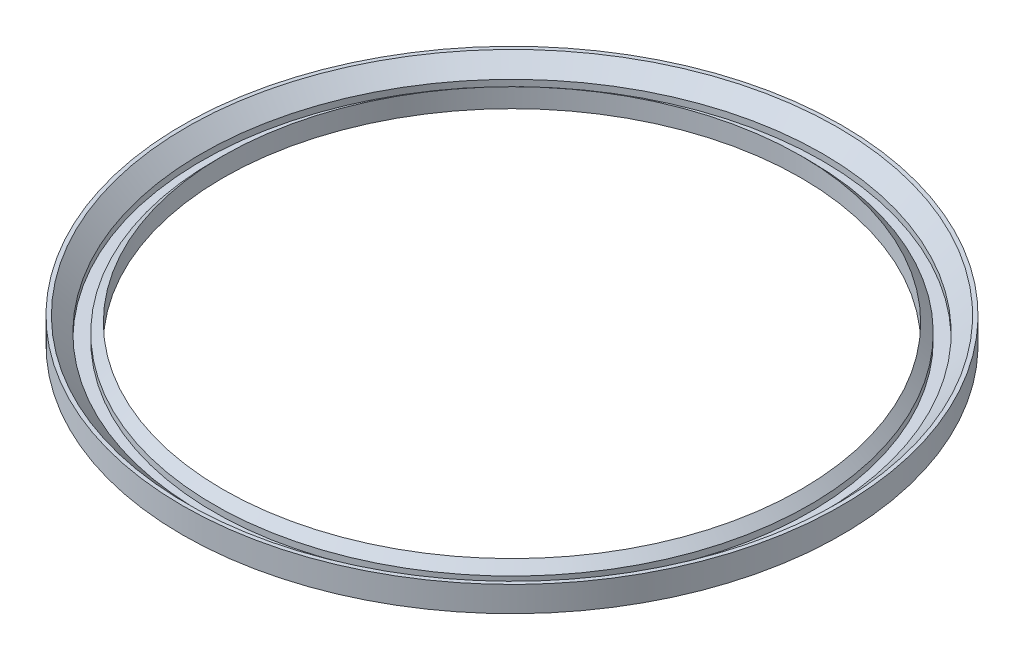
ISO-10303-21;
HEADER;
FILE_DESCRIPTION(('STEP AP214'),'2;1');
FILE_NAME('part.step','',(''),(''),'','','');
FILE_SCHEMA(('AUTOMOTIVE_DESIGN { 1 0 10303 214 1 1 1 1 }'));
ENDSEC;
DATA;
#1=APPLICATION_CONTEXT('core data for automotive mechanical design processes');
#2=APPLICATION_PROTOCOL_DEFINITION('international standard','automotive_design',2000,#1);
#3=PRODUCT_CONTEXT('',#1,'mechanical');
#4=PRODUCT('Part','Part','',(#3));
#5=PRODUCT_RELATED_PRODUCT_CATEGORY('part','',(#4));
#6=PRODUCT_DEFINITION_FORMATION('','',#4);
#7=PRODUCT_DEFINITION_CONTEXT('part definition',#1,'design');
#8=PRODUCT_DEFINITION('design','',#6,#7);
#9=PRODUCT_DEFINITION_SHAPE('','',#8);
#10=(LENGTH_UNIT() NAMED_UNIT(*) SI_UNIT(.MILLI.,.METRE.));
#11=(NAMED_UNIT(*) PLANE_ANGLE_UNIT() SI_UNIT($,.RADIAN.));
#12=(NAMED_UNIT(*) SI_UNIT($,.STERADIAN.) SOLID_ANGLE_UNIT());
#13=UNCERTAINTY_MEASURE_WITH_UNIT(LENGTH_MEASURE(1.E-05),#10,'distance_accuracy_value','');
#14=(GEOMETRIC_REPRESENTATION_CONTEXT(3) GLOBAL_UNCERTAINTY_ASSIGNED_CONTEXT((#13)) GLOBAL_UNIT_ASSIGNED_CONTEXT((#10,
#11,#12)) REPRESENTATION_CONTEXT('',''));
#15=CARTESIAN_POINT('',(0.,0.,0.));
#16=DIRECTION('',(0.,0.,1.));
#17=DIRECTION('',(1.,0.,0.));
#18=AXIS2_PLACEMENT_3D('',#15,#16,#17);
#19=CARTESIAN_POINT('',(0.,-28.6657349216588,0.));
#20=DIRECTION('',(0.,-1.,0.));
#21=DIRECTION('',(0.,0.,-1.));
#22=AXIS2_PLACEMENT_3D('',#19,#20,#21);
#23=CYLINDRICAL_SURFACE('',#22,29.375);
#24=CARTESIAN_POINT('',(0.,-2.12132034355963,0.));
#25=DIRECTION('',(0.,-1.,0.));
#26=DIRECTION('',(0.,0.,-1.));
#27=AXIS2_PLACEMENT_3D('',#24,#25,#26);
#28=CIRCLE('',#27,29.375);
#29=CARTESIAN_POINT('',(0.,-2.12132034355963,-29.375));
#30=VERTEX_POINT('',#29);
#31=EDGE_CURVE('E10',#30,#30,#28,.T.);
#32=ORIENTED_EDGE('',*,*,#31,.F.);
#33=EDGE_LOOP('',(#32));
#34=FACE_BOUND('',#33,.T.);
#35=CARTESIAN_POINT('',(0.,-1.49632034355964,0.));
#36=DIRECTION('',(0.,-1.,0.));
#37=DIRECTION('',(0.,0.,-1.));
#38=AXIS2_PLACEMENT_3D('',#35,#36,#37);
#39=CIRCLE('',#38,29.375);
#40=CARTESIAN_POINT('',(0.,-1.49632034355964,-29.375));
#41=VERTEX_POINT('',#40);
#42=EDGE_CURVE('E46',#41,#41,#39,.T.);
#43=ORIENTED_EDGE('',*,*,#42,.T.);
#44=EDGE_LOOP('',(#43));
#45=FACE_BOUND('',#44,.T.);
#46=ADVANCED_FACE('F30',(#34,#45),#23,.T.);
#47=CARTESIAN_POINT('',(29.375,-2.12132034355964,0.));
#48=DIRECTION('',(0.,-1.,0.));
#49=DIRECTION('',(0.,0.,-1.));
#50=AXIS2_PLACEMENT_3D('',#47,#48,#49);
#51=PLANE('',#50);
#52=CARTESIAN_POINT('',(0.,-2.12132034355963,0.));
#53=DIRECTION('',(0.,-1.,0.));
#54=DIRECTION('',(0.,0.,-1.));
#55=AXIS2_PLACEMENT_3D('',#52,#53,#54);
#56=CIRCLE('',#55,30.625);
#57=CARTESIAN_POINT('',(0.,-2.12132034355963,-30.625));
#58=VERTEX_POINT('',#57);
#59=EDGE_CURVE('E37',#58,#58,#56,.T.);
#60=ORIENTED_EDGE('',*,*,#59,.F.);
#61=EDGE_LOOP('',(#60));
#62=FACE_BOUND('',#61,.T.);
#63=ORIENTED_EDGE('',*,*,#31,.T.);
#64=EDGE_LOOP('',(#63));
#65=FACE_BOUND('',#64,.T.);
#66=ADVANCED_FACE('F82',(#62,#65),#51,.F.);
#67=CARTESIAN_POINT('',(0.,-28.6657349216588,0.));
#68=DIRECTION('',(0.,-1.,0.));
#69=DIRECTION('',(0.,0.,-1.));
#70=AXIS2_PLACEMENT_3D('',#67,#68,#69);
#71=CYLINDRICAL_SURFACE('',#70,30.625);
#72=CARTESIAN_POINT('',(0.,-1.49632034355963,0.));
#73=DIRECTION('',(0.,-1.,0.));
#74=DIRECTION('',(0.,0.,-1.));
#75=AXIS2_PLACEMENT_3D('',#72,#73,#74);
#76=CIRCLE('',#75,30.625);
#77=CARTESIAN_POINT('',(0.,-1.49632034355963,-30.625));
#78=VERTEX_POINT('',#77);
#79=EDGE_CURVE('E41',#78,#78,#76,.T.);
#80=ORIENTED_EDGE('',*,*,#79,.F.);
#81=EDGE_LOOP('',(#80));
#82=FACE_BOUND('',#81,.T.);
#83=ORIENTED_EDGE('',*,*,#59,.T.);
#84=EDGE_LOOP('',(#83));
#85=FACE_BOUND('',#84,.T.);
#86=ADVANCED_FACE('F76',(#82,#85),#71,.F.);
#87=CARTESIAN_POINT('',(0.,-1.49632034355963,0.));
#88=DIRECTION('',(0.,1.,0.));
#89=DIRECTION('',(0.,0.,1.));
#90=AXIS2_PLACEMENT_3D('',#87,#88,#89);
#91=CONICAL_SURFACE('',#90,30.625,0.785398163397444);
#92=CARTESIAN_POINT('',(0.,0.,0.));
#93=DIRECTION('',(0.,-1.,0.));
#94=DIRECTION('',(0.,0.,-1.));
#95=AXIS2_PLACEMENT_3D('',#92,#93,#94);
#96=CIRCLE('',#95,32.1213203435596);
#97=CARTESIAN_POINT('',(0.,0.,-32.1213203435596));
#98=VERTEX_POINT('',#97);
#99=EDGE_CURVE('E52',#98,#98,#96,.F.);
#100=ORIENTED_EDGE('',*,*,#99,.T.);
#101=EDGE_LOOP('',(#100));
#102=FACE_BOUND('',#101,.T.);
#103=ORIENTED_EDGE('',*,*,#79,.T.);
#104=EDGE_LOOP('',(#103));
#105=FACE_BOUND('',#104,.T.);
#106=ADVANCED_FACE('F72',(#102,#105),#91,.F.);
#107=CARTESIAN_POINT('',(0.,0.,0.));
#108=DIRECTION('',(0.,-1.,0.));
#109=DIRECTION('',(0.,0.,-1.));
#110=AXIS2_PLACEMENT_3D('',#107,#108,#109);
#111=CONICAL_SURFACE('',#110,27.8786796564404,0.785398163397451);
#112=CARTESIAN_POINT('',(0.,-0.621320343559645,0.));
#113=DIRECTION('',(0.,-1.,0.));
#114=DIRECTION('',(0.,0.,-1.));
#115=AXIS2_PLACEMENT_3D('',#112,#113,#114);
#116=CIRCLE('',#115,28.5);
#117=CARTESIAN_POINT('',(0.,-0.621320343559645,-28.5));
#118=VERTEX_POINT('',#117);
#119=EDGE_CURVE('E33',#118,#118,#116,.T.);
#120=ORIENTED_EDGE('',*,*,#119,.T.);
#121=EDGE_LOOP('',(#120));
#122=FACE_BOUND('',#121,.T.);
#123=ORIENTED_EDGE('',*,*,#42,.F.);
#124=EDGE_LOOP('',(#123));
#125=FACE_BOUND('',#124,.T.);
#126=ADVANCED_FACE('F75',(#122,#125),#111,.T.);
#127=CARTESIAN_POINT('',(0.,0.,0.));
#128=DIRECTION('',(0.,-1.,0.));
#129=DIRECTION('',(0.,0.,-1.));
#130=AXIS2_PLACEMENT_3D('',#127,#128,#129);
#131=CYLINDRICAL_SURFACE('',#130,28.5);
#132=CARTESIAN_POINT('',(0.,-2.5,0.));
#133=DIRECTION('',(0.,-1.,0.));
#134=DIRECTION('',(0.,0.,-1.));
#135=AXIS2_PLACEMENT_3D('',#132,#133,#134);
#136=CIRCLE('',#135,28.5);
#137=CARTESIAN_POINT('',(0.,-2.5,-28.5));
#138=VERTEX_POINT('',#137);
#139=EDGE_CURVE('E55',#138,#138,#136,.T.);
#140=ORIENTED_EDGE('',*,*,#139,.T.);
#141=EDGE_LOOP('',(#140));
#142=FACE_BOUND('',#141,.T.);
#143=ORIENTED_EDGE('',*,*,#119,.F.);
#144=EDGE_LOOP('',(#143));
#145=FACE_BOUND('',#144,.T.);
#146=ADVANCED_FACE('F68',(#142,#145),#131,.F.);
#147=CARTESIAN_POINT('',(28.5,0.,0.));
#148=DIRECTION('',(0.,-1.,0.));
#149=DIRECTION('',(0.,0.,-1.));
#150=AXIS2_PLACEMENT_3D('',#147,#148,#149);
#151=PLANE('',#150);
#152=CARTESIAN_POINT('',(0.,0.,0.));
#153=DIRECTION('',(0.,-1.,0.));
#154=DIRECTION('',(0.,0.,-1.));
#155=AXIS2_PLACEMENT_3D('',#152,#153,#154);
#156=CIRCLE('',#155,32.5);
#157=CARTESIAN_POINT('',(0.,0.,-32.5));
#158=VERTEX_POINT('',#157);
#159=EDGE_CURVE('E58',#158,#158,#156,.T.);
#160=ORIENTED_EDGE('',*,*,#159,.F.);
#161=EDGE_LOOP('',(#160));
#162=FACE_BOUND('',#161,.T.);
#163=ORIENTED_EDGE('',*,*,#99,.F.);
#164=EDGE_LOOP('',(#163));
#165=FACE_BOUND('',#164,.T.);
#166=ADVANCED_FACE('F65',(#162,#165),#151,.F.);
#167=CARTESIAN_POINT('',(0.,-28.6657349216588,0.));
#168=DIRECTION('',(0.,-1.,0.));
#169=DIRECTION('',(0.,0.,-1.));
#170=AXIS2_PLACEMENT_3D('',#167,#168,#169);
#171=CYLINDRICAL_SURFACE('',#170,32.5);
#172=ORIENTED_EDGE('',*,*,#159,.T.);
#173=EDGE_LOOP('',(#172));
#174=FACE_BOUND('',#173,.T.);
#175=CARTESIAN_POINT('',(0.,-2.5,0.));
#176=DIRECTION('',(0.,-1.,0.));
#177=DIRECTION('',(0.,0.,-1.));
#178=AXIS2_PLACEMENT_3D('',#175,#176,#177);
#179=CIRCLE('',#178,32.5);
#180=CARTESIAN_POINT('',(0.,-2.5,-32.5));
#181=VERTEX_POINT('',#180);
#182=EDGE_CURVE('E49',#181,#181,#179,.T.);
#183=ORIENTED_EDGE('',*,*,#182,.F.);
#184=EDGE_LOOP('',(#183));
#185=FACE_BOUND('',#184,.T.);
#186=ADVANCED_FACE('F62',(#174,#185),#171,.T.);
#187=CARTESIAN_POINT('',(27.5,-2.5,0.));
#188=DIRECTION('',(0.,-1.,0.));
#189=DIRECTION('',(0.,0.,-1.));
#190=AXIS2_PLACEMENT_3D('',#187,#188,#189);
#191=PLANE('',#190);
#192=ORIENTED_EDGE('',*,*,#139,.F.);
#193=EDGE_LOOP('',(#192));
#194=FACE_BOUND('',#193,.T.);
#195=ORIENTED_EDGE('',*,*,#182,.T.);
#196=EDGE_LOOP('',(#195));
#197=FACE_BOUND('',#196,.T.);
#198=ADVANCED_FACE('F97',(#194,#197),#191,.T.);
#199=CLOSED_SHELL('',(#46,#66,#86,#106,#126,#146,#166,#186,#198));
#200=MANIFOLD_SOLID_BREP('B2',#199);
#201=ADVANCED_BREP_SHAPE_REPRESENTATION('',(#18,#200),#14);
#202=SHAPE_DEFINITION_REPRESENTATION(#9,#201);
ENDSEC;
END-ISO-10303-21;
